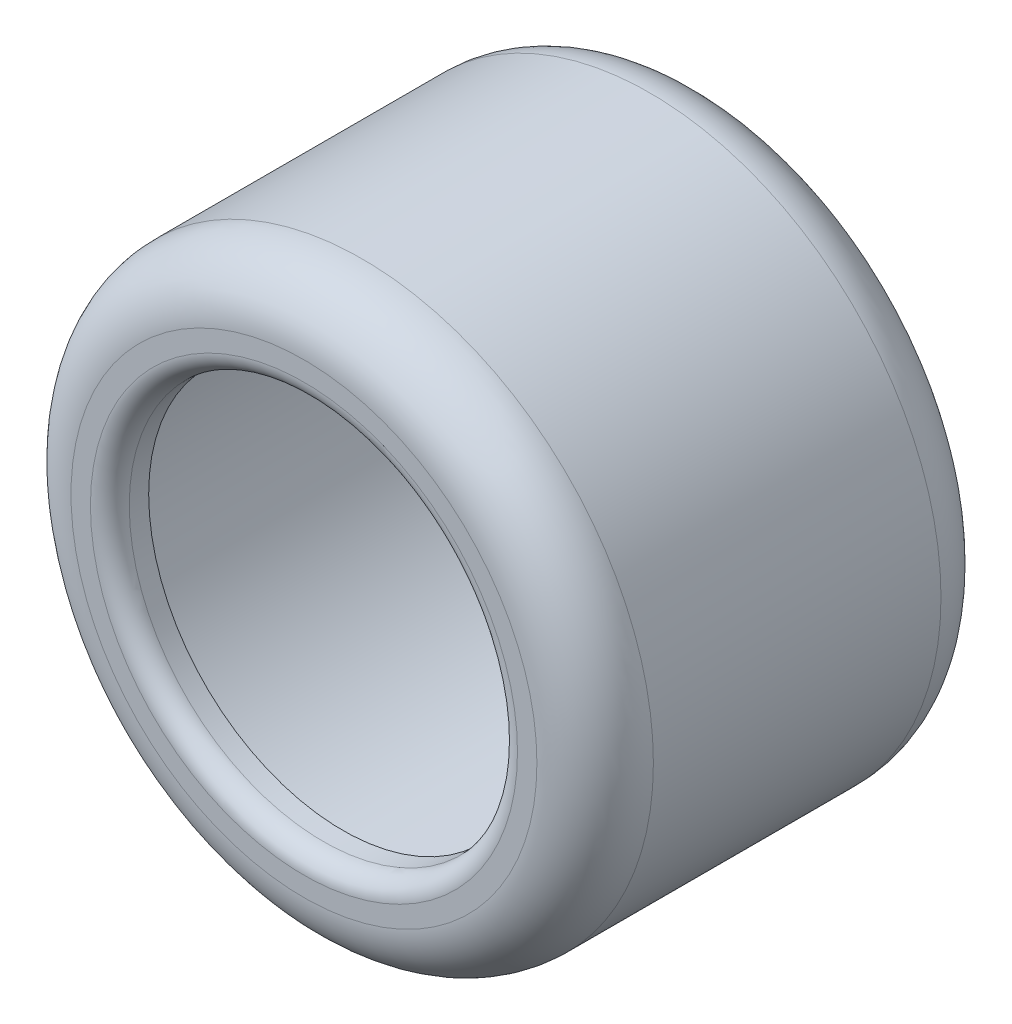
ISO-10303-21;
HEADER;
FILE_DESCRIPTION(('STEP AP214'),'2;1');
FILE_NAME('part.step','',(''),(''),'','','');
FILE_SCHEMA(('AUTOMOTIVE_DESIGN { 1 0 10303 214 1 1 1 1 }'));
ENDSEC;
DATA;
#1=APPLICATION_CONTEXT('core data for automotive mechanical design processes');
#2=APPLICATION_PROTOCOL_DEFINITION('international standard','automotive_design',2000,#1);
#3=PRODUCT_CONTEXT('',#1,'mechanical');
#4=PRODUCT('Part','Part','',(#3));
#5=PRODUCT_RELATED_PRODUCT_CATEGORY('part','',(#4));
#6=PRODUCT_DEFINITION_FORMATION('','',#4);
#7=PRODUCT_DEFINITION_CONTEXT('part definition',#1,'design');
#8=PRODUCT_DEFINITION('design','',#6,#7);
#9=PRODUCT_DEFINITION_SHAPE('','',#8);
#10=(LENGTH_UNIT() NAMED_UNIT(*) SI_UNIT(.MILLI.,.METRE.));
#11=(NAMED_UNIT(*) PLANE_ANGLE_UNIT() SI_UNIT($,.RADIAN.));
#12=(NAMED_UNIT(*) SI_UNIT($,.STERADIAN.) SOLID_ANGLE_UNIT());
#13=UNCERTAINTY_MEASURE_WITH_UNIT(LENGTH_MEASURE(1.E-05),#10,'distance_accuracy_value','');
#14=(GEOMETRIC_REPRESENTATION_CONTEXT(3) GLOBAL_UNCERTAINTY_ASSIGNED_CONTEXT((#13)) GLOBAL_UNIT_ASSIGNED_CONTEXT((#10,
#11,#12)) REPRESENTATION_CONTEXT('',''));
#15=CARTESIAN_POINT('',(0.,0.,0.));
#16=DIRECTION('',(0.,0.,1.));
#17=DIRECTION('',(1.,0.,0.));
#18=AXIS2_PLACEMENT_3D('',#15,#16,#17);
#19=CARTESIAN_POINT('',(0.,0.,93.6685944745748));
#20=DIRECTION('',(0.,0.,-1.));
#21=DIRECTION('',(-1.,0.,0.));
#22=AXIS2_PLACEMENT_3D('',#19,#20,#21);
#23=CYLINDRICAL_SURFACE('',#22,80.);
#24=CARTESIAN_POINT('',(0.,0.,85.6685944745748));
#25=DIRECTION('',(0.,0.,1.));
#26=DIRECTION('',(1.,0.,0.));
#27=AXIS2_PLACEMENT_3D('',#24,#25,#26);
#28=CIRCLE('',#27,80.);
#29=CARTESIAN_POINT('',(80.,0.,85.6685944745748));
#30=VERTEX_POINT('',#29);
#31=EDGE_CURVE('E62',#30,#30,#28,.T.);
#32=ORIENTED_EDGE('',*,*,#31,.T.);
#33=EDGE_LOOP('',(#32));
#34=FACE_BOUND('',#33,.T.);
#35=CARTESIAN_POINT('',(0.,0.,77.6685944745747));
#36=DIRECTION('',(0.,0.,1.));
#37=DIRECTION('',(1.,0.,0.));
#38=AXIS2_PLACEMENT_3D('',#35,#36,#37);
#39=CIRCLE('',#38,80.);
#40=CARTESIAN_POINT('',(80.,0.,77.6685944745747));
#41=VERTEX_POINT('',#40);
#42=EDGE_CURVE('E93',#41,#41,#39,.F.);
#43=ORIENTED_EDGE('',*,*,#42,.T.);
#44=EDGE_LOOP('',(#43));
#45=FACE_BOUND('',#44,.T.);
#46=ADVANCED_FACE('F49',(#34,#45),#23,.F.);
#47=CARTESIAN_POINT('',(0.,0.,93.6685944745748));
#48=DIRECTION('',(0.,0.,1.));
#49=DIRECTION('',(1.,0.,0.));
#50=AXIS2_PLACEMENT_3D('',#47,#48,#49);
#51=PLANE('',#50);
#52=CARTESIAN_POINT('',(0.,0.,93.6685944745748));
#53=DIRECTION('',(0.,0.,1.));
#54=DIRECTION('',(1.,0.,0.));
#55=AXIS2_PLACEMENT_3D('',#52,#53,#54);
#56=CIRCLE('',#55,88.);
#57=CARTESIAN_POINT('',(88.,0.,93.6685944745748));
#58=VERTEX_POINT('',#57);
#59=EDGE_CURVE('E11',#58,#58,#56,.F.);
#60=ORIENTED_EDGE('',*,*,#59,.T.);
#61=EDGE_LOOP('',(#60));
#62=FACE_BOUND('',#61,.T.);
#63=CARTESIAN_POINT('',(0.,0.,93.6685944745748));
#64=DIRECTION('',(0.,0.,1.));
#65=DIRECTION('',(1.,0.,0.));
#66=AXIS2_PLACEMENT_3D('',#63,#64,#65);
#67=CIRCLE('',#66,96.);
#68=CARTESIAN_POINT('',(96.,0.,93.6685944745748));
#69=VERTEX_POINT('',#68);
#70=EDGE_CURVE('E73',#69,#69,#67,.T.);
#71=ORIENTED_EDGE('',*,*,#70,.T.);
#72=EDGE_LOOP('',(#71));
#73=FACE_BOUND('',#72,.T.);
#74=ADVANCED_FACE('F124',(#62,#73),#51,.T.);
#75=CARTESIAN_POINT('',(0.,0.,-72.8533512580026));
#76=DIRECTION('',(0.,0.,1.));
#77=DIRECTION('',(1.,0.,0.));
#78=AXIS2_PLACEMENT_3D('',#75,#76,#77);
#79=PLANE('',#78);
#80=CARTESIAN_POINT('',(0.,0.,-72.8533512580026));
#81=DIRECTION('',(0.,0.,1.));
#82=DIRECTION('',(1.,0.,0.));
#83=AXIS2_PLACEMENT_3D('',#80,#81,#82);
#84=CIRCLE('',#83,88.);
#85=CARTESIAN_POINT('',(88.,0.,-72.8533512580026));
#86=VERTEX_POINT('',#85);
#87=EDGE_CURVE('E67',#86,#86,#84,.T.);
#88=ORIENTED_EDGE('',*,*,#87,.T.);
#89=EDGE_LOOP('',(#88));
#90=FACE_BOUND('',#89,.T.);
#91=CARTESIAN_POINT('',(0.,0.,-72.8533512580026));
#92=DIRECTION('',(0.,0.,1.));
#93=DIRECTION('',(1.,0.,0.));
#94=AXIS2_PLACEMENT_3D('',#91,#92,#93);
#95=CIRCLE('',#94,96.);
#96=CARTESIAN_POINT('',(96.,0.,-72.8533512580026));
#97=VERTEX_POINT('',#96);
#98=EDGE_CURVE('E77',#97,#97,#95,.F.);
#99=ORIENTED_EDGE('',*,*,#98,.T.);
#100=EDGE_LOOP('',(#99));
#101=FACE_BOUND('',#100,.T.);
#102=ADVANCED_FACE('F131',(#90,#101),#79,.F.);
#103=CARTESIAN_POINT('',(0.,0.,93.6685944745748));
#104=DIRECTION('',(0.,0.,-1.));
#105=DIRECTION('',(-1.,0.,0.));
#106=AXIS2_PLACEMENT_3D('',#103,#104,#105);
#107=CYLINDRICAL_SURFACE('',#106,120.);
#108=CARTESIAN_POINT('',(0.,0.,-48.8533512580026));
#109=DIRECTION('',(0.,0.,1.));
#110=DIRECTION('',(1.,0.,0.));
#111=AXIS2_PLACEMENT_3D('',#108,#109,#110);
#112=CIRCLE('',#111,120.);
#113=CARTESIAN_POINT('',(120.,0.,-48.8533512580026));
#114=VERTEX_POINT('',#113);
#115=EDGE_CURVE('E81',#114,#114,#112,.T.);
#116=ORIENTED_EDGE('',*,*,#115,.T.);
#117=EDGE_LOOP('',(#116));
#118=FACE_BOUND('',#117,.T.);
#119=CARTESIAN_POINT('',(0.,0.,69.6685944745748));
#120=DIRECTION('',(0.,0.,1.));
#121=DIRECTION('',(1.,0.,0.));
#122=AXIS2_PLACEMENT_3D('',#119,#120,#121);
#123=CIRCLE('',#122,120.);
#124=CARTESIAN_POINT('',(120.,0.,69.6685944745748));
#125=VERTEX_POINT('',#124);
#126=EDGE_CURVE('E85',#125,#125,#123,.F.);
#127=ORIENTED_EDGE('',*,*,#126,.T.);
#128=EDGE_LOOP('',(#127));
#129=FACE_BOUND('',#128,.T.);
#130=ADVANCED_FACE('F136',(#118,#129),#107,.T.);
#131=CARTESIAN_POINT('',(0.,0.,-56.8533512580026));
#132=DIRECTION('',(0.,0.,1.));
#133=DIRECTION('',(1.,0.,0.));
#134=AXIS2_PLACEMENT_3D('',#131,#132,#133);
#135=CIRCLE('',#134,80.);
#136=CARTESIAN_POINT('',(80.,0.,-56.8533512580026));
#137=VERTEX_POINT('',#136);
#138=EDGE_CURVE('E89',#137,#137,#135,.F.);
#139=ORIENTED_EDGE('',*,*,#138,.F.);
#140=EDGE_LOOP('',(#139));
#141=FACE_BOUND('',#140,.T.);
#142=CARTESIAN_POINT('',(0.,0.,-64.8533512580026));
#143=DIRECTION('',(0.,0.,1.));
#144=DIRECTION('',(1.,0.,0.));
#145=AXIS2_PLACEMENT_3D('',#142,#143,#144);
#146=CIRCLE('',#145,80.);
#147=CARTESIAN_POINT('',(80.,0.,-64.8533512580026));
#148=VERTEX_POINT('',#147);
#149=EDGE_CURVE('E57',#148,#148,#146,.F.);
#150=ORIENTED_EDGE('',*,*,#149,.T.);
#151=EDGE_LOOP('',(#150));
#152=FACE_BOUND('',#151,.T.);
#153=ADVANCED_FACE('F127',(#141,#152),#23,.F.);
#154=CARTESIAN_POINT('',(0.,0.,-48.8533512580026));
#155=DIRECTION('',(0.,0.,1.));
#156=DIRECTION('',(1.,0.,0.));
#157=AXIS2_PLACEMENT_3D('',#154,#155,#156);
#158=TOROIDAL_SURFACE('',#157,96.,24.);
#159=ORIENTED_EDGE('',*,*,#98,.F.);
#160=EDGE_LOOP('',(#159));
#161=FACE_BOUND('',#160,.T.);
#162=ORIENTED_EDGE('',*,*,#115,.F.);
#163=EDGE_LOOP('',(#162));
#164=FACE_BOUND('',#163,.T.);
#165=ADVANCED_FACE('F135',(#161,#164),#158,.T.);
#166=CARTESIAN_POINT('',(0.,0.,69.6685944745748));
#167=DIRECTION('',(0.,0.,1.));
#168=DIRECTION('',(1.,0.,0.));
#169=AXIS2_PLACEMENT_3D('',#166,#167,#168);
#170=TOROIDAL_SURFACE('',#169,96.,24.);
#171=ORIENTED_EDGE('',*,*,#126,.F.);
#172=EDGE_LOOP('',(#171));
#173=FACE_BOUND('',#172,.T.);
#174=ORIENTED_EDGE('',*,*,#70,.F.);
#175=EDGE_LOOP('',(#174));
#176=FACE_BOUND('',#175,.T.);
#177=ADVANCED_FACE('F142',(#173,#176),#170,.T.);
#178=CARTESIAN_POINT('',(0.,0.,-64.8533512580026));
#179=DIRECTION('',(0.,0.,1.));
#180=DIRECTION('',(1.,0.,0.));
#181=AXIS2_PLACEMENT_3D('',#178,#179,#180);
#182=TOROIDAL_SURFACE('',#181,88.,8.);
#183=ORIENTED_EDGE('',*,*,#149,.F.);
#184=EDGE_LOOP('',(#183));
#185=FACE_BOUND('',#184,.T.);
#186=ORIENTED_EDGE('',*,*,#87,.F.);
#187=EDGE_LOOP('',(#186));
#188=FACE_BOUND('',#187,.T.);
#189=ADVANCED_FACE('F203',(#185,#188),#182,.T.);
#190=CARTESIAN_POINT('',(0.,0.,85.6685944745748));
#191=DIRECTION('',(0.,0.,1.));
#192=DIRECTION('',(1.,0.,0.));
#193=AXIS2_PLACEMENT_3D('',#190,#191,#192);
#194=TOROIDAL_SURFACE('',#193,88.,8.);
#195=ORIENTED_EDGE('',*,*,#59,.F.);
#196=EDGE_LOOP('',(#195));
#197=FACE_BOUND('',#196,.T.);
#198=ORIENTED_EDGE('',*,*,#31,.F.);
#199=EDGE_LOOP('',(#198));
#200=FACE_BOUND('',#199,.T.);
#201=ADVANCED_FACE('F51',(#197,#200),#194,.T.);
#202=CARTESIAN_POINT('',(0.,0.,77.6685944745747));
#203=DIRECTION('',(0.,0.,1.));
#204=DIRECTION('',(1.,0.,0.));
#205=AXIS2_PLACEMENT_3D('',#202,#203,#204);
#206=PLANE('',#205);
#207=CARTESIAN_POINT('',(0.,0.,77.6685944745748));
#208=DIRECTION('',(0.,0.,1.));
#209=DIRECTION('',(1.,0.,0.));
#210=AXIS2_PLACEMENT_3D('',#207,#208,#209);
#211=CIRCLE('',#210,96.);
#212=CARTESIAN_POINT('',(96.,0.,77.6685944745748));
#213=VERTEX_POINT('',#212);
#214=EDGE_CURVE('E97',#213,#213,#211,.T.);
#215=ORIENTED_EDGE('',*,*,#214,.F.);
#216=EDGE_LOOP('',(#215));
#217=FACE_BOUND('',#216,.T.);
#218=ORIENTED_EDGE('',*,*,#42,.F.);
#219=EDGE_LOOP('',(#218));
#220=FACE_BOUND('',#219,.T.);
#221=ADVANCED_FACE('F116',(#217,#220),#206,.F.);
#222=CARTESIAN_POINT('',(0.,0.,-56.8533512580026));
#223=DIRECTION('',(0.,0.,1.));
#224=DIRECTION('',(1.,0.,0.));
#225=AXIS2_PLACEMENT_3D('',#222,#223,#224);
#226=PLANE('',#225);
#227=CARTESIAN_POINT('',(0.,0.,-56.8533512580026));
#228=DIRECTION('',(0.,0.,1.));
#229=DIRECTION('',(1.,0.,0.));
#230=AXIS2_PLACEMENT_3D('',#227,#228,#229);
#231=CIRCLE('',#230,96.);
#232=CARTESIAN_POINT('',(96.,0.,-56.8533512580026));
#233=VERTEX_POINT('',#232);
#234=EDGE_CURVE('E98',#233,#233,#231,.F.);
#235=ORIENTED_EDGE('',*,*,#234,.F.);
#236=EDGE_LOOP('',(#235));
#237=FACE_BOUND('',#236,.T.);
#238=ORIENTED_EDGE('',*,*,#138,.T.);
#239=EDGE_LOOP('',(#238));
#240=FACE_BOUND('',#239,.T.);
#241=ADVANCED_FACE('F119',(#237,#240),#226,.T.);
#242=CARTESIAN_POINT('',(0.,0.,93.6685944745748));
#243=DIRECTION('',(0.,0.,-1.));
#244=DIRECTION('',(-1.,0.,0.));
#245=AXIS2_PLACEMENT_3D('',#242,#243,#244);
#246=CYLINDRICAL_SURFACE('',#245,104.);
#247=CARTESIAN_POINT('',(0.,0.,-48.8533512580026));
#248=DIRECTION('',(0.,0.,-1.));
#249=DIRECTION('',(-1.,0.,0.));
#250=AXIS2_PLACEMENT_3D('',#247,#248,#249);
#251=CIRCLE('',#250,104.);
#252=CARTESIAN_POINT('',(-104.,0.,-48.8533512580026));
#253=VERTEX_POINT('',#252);
#254=EDGE_CURVE('E102',#253,#253,#251,.F.);
#255=ORIENTED_EDGE('',*,*,#254,.F.);
#256=EDGE_LOOP('',(#255));
#257=FACE_BOUND('',#256,.T.);
#258=CARTESIAN_POINT('',(0.,0.,69.6685944745748));
#259=DIRECTION('',(0.,0.,-1.));
#260=DIRECTION('',(-1.,0.,0.));
#261=AXIS2_PLACEMENT_3D('',#258,#259,#260);
#262=CIRCLE('',#261,104.);
#263=CARTESIAN_POINT('',(-104.,0.,69.6685944745748));
#264=VERTEX_POINT('',#263);
#265=EDGE_CURVE('E106',#264,#264,#262,.T.);
#266=ORIENTED_EDGE('',*,*,#265,.F.);
#267=EDGE_LOOP('',(#266));
#268=FACE_BOUND('',#267,.T.);
#269=ADVANCED_FACE('F150',(#257,#268),#246,.F.);
#270=CARTESIAN_POINT('',(0.,0.,-48.8533512580026));
#271=DIRECTION('',(0.,0.,1.));
#272=DIRECTION('',(1.,0.,0.));
#273=AXIS2_PLACEMENT_3D('',#270,#271,#272);
#274=TOROIDAL_SURFACE('',#273,96.,8.);
#275=ORIENTED_EDGE('',*,*,#234,.T.);
#276=EDGE_LOOP('',(#275));
#277=FACE_BOUND('',#276,.T.);
#278=ORIENTED_EDGE('',*,*,#254,.T.);
#279=EDGE_LOOP('',(#278));
#280=FACE_BOUND('',#279,.T.);
#281=ADVANCED_FACE('F156',(#277,#280),#274,.F.);
#282=CARTESIAN_POINT('',(0.,0.,69.6685944745748));
#283=DIRECTION('',(0.,0.,1.));
#284=DIRECTION('',(1.,0.,0.));
#285=AXIS2_PLACEMENT_3D('',#282,#283,#284);
#286=TOROIDAL_SURFACE('',#285,96.,8.);
#287=ORIENTED_EDGE('',*,*,#265,.T.);
#288=EDGE_LOOP('',(#287));
#289=FACE_BOUND('',#288,.T.);
#290=ORIENTED_EDGE('',*,*,#214,.T.);
#291=EDGE_LOOP('',(#290));
#292=FACE_BOUND('',#291,.T.);
#293=ADVANCED_FACE('F114',(#289,#292),#286,.F.);
#294=CLOSED_SHELL('',(#46,#74,#102,#130,#153,#165,#177,#189,#201,#221,#241,#269,#281,#293));
#295=MANIFOLD_SOLID_BREP('B2',#294);
#296=ADVANCED_BREP_SHAPE_REPRESENTATION('',(#18,#295),#14);
#297=SHAPE_DEFINITION_REPRESENTATION(#9,#296);
ENDSEC;
END-ISO-10303-21;
